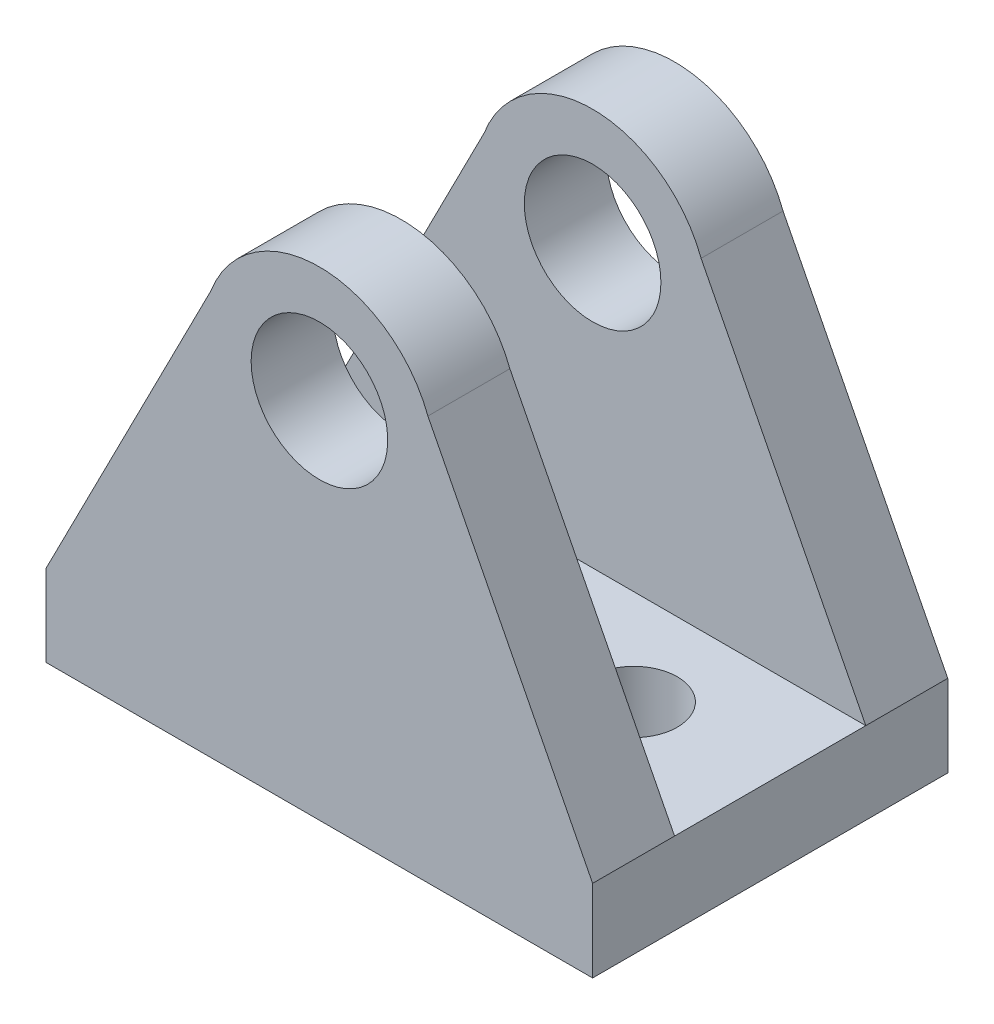
ISO-10303-21;
HEADER;
FILE_DESCRIPTION(('STEP AP214'),'2;1');
FILE_NAME('part.step','',(''),(''),'','','');
FILE_SCHEMA(('AUTOMOTIVE_DESIGN { 1 0 10303 214 1 1 1 1 }'));
ENDSEC;
DATA;
#1=APPLICATION_CONTEXT('core data for automotive mechanical design processes');
#2=APPLICATION_PROTOCOL_DEFINITION('international standard','automotive_design',2000,#1);
#3=PRODUCT_CONTEXT('',#1,'mechanical');
#4=PRODUCT('Part','Part','',(#3));
#5=PRODUCT_RELATED_PRODUCT_CATEGORY('part','',(#4));
#6=PRODUCT_DEFINITION_FORMATION('','',#4);
#7=PRODUCT_DEFINITION_CONTEXT('part definition',#1,'design');
#8=PRODUCT_DEFINITION('design','',#6,#7);
#9=PRODUCT_DEFINITION_SHAPE('','',#8);
#10=(LENGTH_UNIT() NAMED_UNIT(*) SI_UNIT(.MILLI.,.METRE.));
#11=(NAMED_UNIT(*) PLANE_ANGLE_UNIT() SI_UNIT($,.RADIAN.));
#12=(NAMED_UNIT(*) SI_UNIT($,.STERADIAN.) SOLID_ANGLE_UNIT());
#13=UNCERTAINTY_MEASURE_WITH_UNIT(LENGTH_MEASURE(1.E-05),#10,'distance_accuracy_value','');
#14=(GEOMETRIC_REPRESENTATION_CONTEXT(3) GLOBAL_UNCERTAINTY_ASSIGNED_CONTEXT((#13)) GLOBAL_UNIT_ASSIGNED_CONTEXT((#10,
#11,#12)) REPRESENTATION_CONTEXT('',''));
#15=CARTESIAN_POINT('',(0.,0.,0.));
#16=DIRECTION('',(0.,0.,1.));
#17=DIRECTION('',(1.,0.,0.));
#18=AXIS2_PLACEMENT_3D('',#15,#16,#17);
#19=CARTESIAN_POINT('',(45.3430756374336,0.,-44.2194258680597));
#20=DIRECTION('',(1.,0.,0.));
#21=DIRECTION('',(0.,0.,-1.));
#22=AXIS2_PLACEMENT_3D('',#19,#20,#21);
#23=PLANE('',#22);
#24=DIRECTION('',(0.,0.,-1.));
#25=VECTOR('',#24,1.);
#26=CARTESIAN_POINT('',(45.3430756374336,3.,-44.2194258680597));
#27=LINE('',#26,#25);
#28=CARTESIAN_POINT('',(45.3430756374336,3.,-44.2194258680597));
#29=VERTEX_POINT('',#28);
#30=CARTESIAN_POINT('',(45.3430756374336,3.,-51.2194258680596));
#31=VERTEX_POINT('',#30);
#32=EDGE_CURVE('E168',#29,#31,#27,.T.);
#33=ORIENTED_EDGE('',*,*,#32,.F.);
#34=DIRECTION('',(0.,0.,-1.));
#35=VECTOR('',#34,1.);
#36=CARTESIAN_POINT('',(45.3430756374336,3.,-41.2194258680597));
#37=LINE('',#36,#35);
#38=CARTESIAN_POINT('',(45.3430756374336,3.,-41.2194258680597));
#39=VERTEX_POINT('',#38);
#40=EDGE_CURVE('E48',#39,#29,#37,.T.);
#41=ORIENTED_EDGE('',*,*,#40,.F.);
#42=DIRECTION('',(0.,1.,0.));
#43=VECTOR('',#42,1.);
#44=CARTESIAN_POINT('',(45.3430756374336,3.,-41.2194258680597));
#45=LINE('',#44,#43);
#46=CARTESIAN_POINT('',(45.3430756374336,0.,-41.2194258680597));
#47=VERTEX_POINT('',#46);
#48=EDGE_CURVE('E140',#47,#39,#45,.T.);
#49=ORIENTED_EDGE('',*,*,#48,.F.);
#50=DIRECTION('',(0.,0.,-1.));
#51=VECTOR('',#50,1.);
#52=CARTESIAN_POINT('',(45.3430756374336,0.,-44.2194258680597));
#53=LINE('',#52,#51);
#54=CARTESIAN_POINT('',(45.3430756374336,0.,-54.2194258680596));
#55=VERTEX_POINT('',#54);
#56=EDGE_CURVE('E40',#47,#55,#53,.T.);
#57=ORIENTED_EDGE('',*,*,#56,.T.);
#58=DIRECTION('',(0.,-1.,0.));
#59=VECTOR('',#58,1.);
#60=CARTESIAN_POINT('',(45.3430756374336,0.,-54.2194258680596));
#61=LINE('',#60,#59);
#62=CARTESIAN_POINT('',(45.3430756374336,3.,-54.2194258680596));
#63=VERTEX_POINT('',#62);
#64=EDGE_CURVE('E196',#63,#55,#61,.T.);
#65=ORIENTED_EDGE('',*,*,#64,.F.);
#66=DIRECTION('',(0.,0.,1.));
#67=VECTOR('',#66,1.);
#68=CARTESIAN_POINT('',(45.3430756374336,3.,-54.2194258680596));
#69=LINE('',#68,#67);
#70=EDGE_CURVE('E201',#63,#31,#69,.T.);
#71=ORIENTED_EDGE('',*,*,#70,.T.);
#72=EDGE_LOOP('',(#33,#41,#49,#57,#65,#71));
#73=FACE_BOUND('',#72,.T.);
#74=ADVANCED_FACE('F32',(#73),#23,.T.);
#75=CARTESIAN_POINT('',(25.3430756374335,0.,-51.2194258680596));
#76=DIRECTION('',(-1.,0.,0.));
#77=DIRECTION('',(0.,0.,1.));
#78=AXIS2_PLACEMENT_3D('',#75,#76,#77);
#79=PLANE('',#78);
#80=DIRECTION('',(0.,0.,1.));
#81=VECTOR('',#80,1.);
#82=CARTESIAN_POINT('',(25.3430756374335,3.,-51.2194258680596));
#83=LINE('',#82,#81);
#84=CARTESIAN_POINT('',(25.3430756374335,3.,-51.2194258680596));
#85=VERTEX_POINT('',#84);
#86=CARTESIAN_POINT('',(25.3430756374335,3.,-44.2194258680597));
#87=VERTEX_POINT('',#86);
#88=EDGE_CURVE('E130',#85,#87,#83,.T.);
#89=ORIENTED_EDGE('',*,*,#88,.F.);
#90=DIRECTION('',(0.,0.,1.));
#91=VECTOR('',#90,1.);
#92=CARTESIAN_POINT('',(25.3430756374335,3.,-54.2194258680596));
#93=LINE('',#92,#91);
#94=CARTESIAN_POINT('',(25.3430756374335,3.,-54.2194258680596));
#95=VERTEX_POINT('',#94);
#96=EDGE_CURVE('E56',#95,#85,#93,.T.);
#97=ORIENTED_EDGE('',*,*,#96,.F.);
#98=DIRECTION('',(0.,1.,0.));
#99=VECTOR('',#98,1.);
#100=CARTESIAN_POINT('',(25.3430756374335,3.,-54.2194258680596));
#101=LINE('',#100,#99);
#102=CARTESIAN_POINT('',(25.3430756374335,0.,-54.2194258680596));
#103=VERTEX_POINT('',#102);
#104=EDGE_CURVE('E115',#103,#95,#101,.T.);
#105=ORIENTED_EDGE('',*,*,#104,.F.);
#106=DIRECTION('',(0.,0.,1.));
#107=VECTOR('',#106,1.);
#108=CARTESIAN_POINT('',(25.3430756374335,0.,-51.2194258680596));
#109=LINE('',#108,#107);
#110=CARTESIAN_POINT('',(25.3430756374335,0.,-41.2194258680597));
#111=VERTEX_POINT('',#110);
#112=EDGE_CURVE('E11',#103,#111,#109,.T.);
#113=ORIENTED_EDGE('',*,*,#112,.T.);
#114=DIRECTION('',(0.,-1.,0.));
#115=VECTOR('',#114,1.);
#116=CARTESIAN_POINT('',(25.3430756374335,0.,-41.2194258680597));
#117=LINE('',#116,#115);
#118=CARTESIAN_POINT('',(25.3430756374335,3.,-41.2194258680597));
#119=VERTEX_POINT('',#118);
#120=EDGE_CURVE('E150',#119,#111,#117,.T.);
#121=ORIENTED_EDGE('',*,*,#120,.F.);
#122=DIRECTION('',(0.,0.,-1.));
#123=VECTOR('',#122,1.);
#124=CARTESIAN_POINT('',(25.3430756374335,3.,-41.2194258680597));
#125=LINE('',#124,#123);
#126=EDGE_CURVE('E155',#119,#87,#125,.T.);
#127=ORIENTED_EDGE('',*,*,#126,.T.);
#128=EDGE_LOOP('',(#89,#97,#105,#113,#121,#127));
#129=FACE_BOUND('',#128,.T.);
#130=ADVANCED_FACE('F127',(#129),#79,.T.);
#131=CARTESIAN_POINT('',(0.,0.,0.));
#132=DIRECTION('',(0.,1.,0.));
#133=DIRECTION('',(0.,0.,1.));
#134=AXIS2_PLACEMENT_3D('',#131,#132,#133);
#135=PLANE('',#134);
#136=CARTESIAN_POINT('',(40.3430756374337,0.,-47.7194258680598));
#137=DIRECTION('',(0.,-1.,0.));
#138=DIRECTION('',(0.,0.,-1.));
#139=AXIS2_PLACEMENT_3D('',#136,#137,#138);
#140=CIRCLE('',#139,1.59999999999981);
#141=CARTESIAN_POINT('',(40.3430756374337,0.,-49.3194258680596));
#142=VERTEX_POINT('',#141);
#143=EDGE_CURVE('E232',#142,#142,#140,.T.);
#144=ORIENTED_EDGE('',*,*,#143,.F.);
#145=EDGE_LOOP('',(#144));
#146=FACE_BOUND('',#145,.T.);
#147=CARTESIAN_POINT('',(30.3430756374334,0.,-47.7194258680598));
#148=DIRECTION('',(0.,-1.,0.));
#149=DIRECTION('',(0.,0.,-1.));
#150=AXIS2_PLACEMENT_3D('',#147,#148,#149);
#151=CIRCLE('',#150,1.59999999999981);
#152=CARTESIAN_POINT('',(30.3430756374334,0.,-49.3194258680596));
#153=VERTEX_POINT('',#152);
#154=EDGE_CURVE('E226',#153,#153,#151,.T.);
#155=ORIENTED_EDGE('',*,*,#154,.F.);
#156=EDGE_LOOP('',(#155));
#157=FACE_BOUND('',#156,.T.);
#158=ORIENTED_EDGE('',*,*,#56,.F.);
#159=DIRECTION('',(1.,0.,0.));
#160=VECTOR('',#159,1.);
#161=CARTESIAN_POINT('',(45.3430756374336,0.,-41.2194258680597));
#162=LINE('',#161,#160);
#163=EDGE_CURVE('E153',#111,#47,#162,.T.);
#164=ORIENTED_EDGE('',*,*,#163,.F.);
#165=ORIENTED_EDGE('',*,*,#112,.F.);
#166=DIRECTION('',(-1.,0.,0.));
#167=VECTOR('',#166,1.);
#168=CARTESIAN_POINT('',(25.3430756374335,0.,-54.2194258680596));
#169=LINE('',#168,#167);
#170=EDGE_CURVE('E122',#55,#103,#169,.T.);
#171=ORIENTED_EDGE('',*,*,#170,.F.);
#172=EDGE_LOOP('',(#158,#164,#165,#171));
#173=FACE_BOUND('',#172,.T.);
#174=ADVANCED_FACE('F192',(#146,#157,#173),#135,.F.);
#175=CARTESIAN_POINT('',(0.,3.,0.));
#176=DIRECTION('',(0.,1.,0.));
#177=DIRECTION('',(0.,0.,1.));
#178=AXIS2_PLACEMENT_3D('',#175,#176,#177);
#179=PLANE('',#178);
#180=CARTESIAN_POINT('',(40.3430756374337,3.,-47.7194258680598));
#181=DIRECTION('',(0.,1.,0.));
#182=DIRECTION('',(0.,0.,1.));
#183=AXIS2_PLACEMENT_3D('',#180,#181,#182);
#184=CIRCLE('',#183,1.59999999999981);
#185=CARTESIAN_POINT('',(40.3430756374337,3.,-46.11942586806));
#186=VERTEX_POINT('',#185);
#187=EDGE_CURVE('E229',#186,#186,#184,.T.);
#188=ORIENTED_EDGE('',*,*,#187,.F.);
#189=EDGE_LOOP('',(#188));
#190=FACE_BOUND('',#189,.T.);
#191=CARTESIAN_POINT('',(30.3430756374334,3.,-47.7194258680598));
#192=DIRECTION('',(0.,1.,0.));
#193=DIRECTION('',(0.,0.,1.));
#194=AXIS2_PLACEMENT_3D('',#191,#192,#193);
#195=CIRCLE('',#194,1.59999999999981);
#196=CARTESIAN_POINT('',(30.3430756374334,3.,-46.11942586806));
#197=VERTEX_POINT('',#196);
#198=EDGE_CURVE('E209',#197,#197,#195,.T.);
#199=ORIENTED_EDGE('',*,*,#198,.F.);
#200=EDGE_LOOP('',(#199));
#201=FACE_BOUND('',#200,.T.);
#202=ORIENTED_EDGE('',*,*,#32,.T.);
#203=DIRECTION('',(-1.,0.,0.));
#204=VECTOR('',#203,1.);
#205=CARTESIAN_POINT('',(45.3430756374336,3.,-51.2194258680596));
#206=LINE('',#205,#204);
#207=EDGE_CURVE('E172',#31,#85,#206,.T.);
#208=ORIENTED_EDGE('',*,*,#207,.T.);
#209=ORIENTED_EDGE('',*,*,#88,.T.);
#210=DIRECTION('',(1.,0.,0.));
#211=VECTOR('',#210,1.);
#212=CARTESIAN_POINT('',(25.3430756374335,3.,-44.2194258680597));
#213=LINE('',#212,#211);
#214=EDGE_CURVE('E35',#87,#29,#213,.T.);
#215=ORIENTED_EDGE('',*,*,#214,.T.);
#216=EDGE_LOOP('',(#202,#208,#209,#215));
#217=FACE_BOUND('',#216,.T.);
#218=ADVANCED_FACE('F175',(#190,#201,#217),#179,.T.);
#219=CARTESIAN_POINT('',(35.3430756374336,13.3,-44.2194258680597));
#220=DIRECTION('',(0.,0.,-1.));
#221=DIRECTION('',(-1.,0.,0.));
#222=AXIS2_PLACEMENT_3D('',#219,#220,#221);
#223=PLANE('',#222);
#224=CARTESIAN_POINT('',(35.3430691595237,13.3000053075812,-44.2194258680597));
#225=DIRECTION('',(0.,0.,-1.));
#226=DIRECTION('',(-1.,0.,0.));
#227=AXIS2_PLACEMENT_3D('',#224,#225,#226);
#228=CIRCLE('',#227,2.49999999999999);
#229=CARTESIAN_POINT('',(32.8430691595237,13.3000053075812,-44.2194258680597));
#230=VERTEX_POINT('',#229);
#231=EDGE_CURVE('E244',#230,#230,#228,.T.);
#232=ORIENTED_EDGE('',*,*,#231,.F.);
#233=EDGE_LOOP('',(#232));
#234=FACE_BOUND('',#233,.T.);
#235=ORIENTED_EDGE('',*,*,#214,.F.);
#236=DIRECTION('',(-0.454990905686481,-0.890496084069209,0.));
#237=VECTOR('',#236,1.);
#238=CARTESIAN_POINT('',(25.3430756374335,3.,-44.2194258680597));
#239=LINE('',#238,#237);
#240=CARTESIAN_POINT('',(31.3721787218253,14.8000000000001,-44.2194258680597));
#241=VERTEX_POINT('',#240);
#242=EDGE_CURVE('E144',#241,#87,#239,.T.);
#243=ORIENTED_EDGE('',*,*,#242,.F.);
#244=CARTESIAN_POINT('',(35.3430756374336,13.3,-44.2194258680597));
#245=DIRECTION('',(0.,0.,1.));
#246=DIRECTION('',(-1.,0.,0.));
#247=AXIS2_PLACEMENT_3D('',#244,#245,#246);
#248=CIRCLE('',#247,4.24476410585876);
#249=CARTESIAN_POINT('',(39.3139725530418,14.8000000000001,-44.2194258680597));
#250=VERTEX_POINT('',#249);
#251=EDGE_CURVE('E134',#250,#241,#248,.T.);
#252=ORIENTED_EDGE('',*,*,#251,.F.);
#253=DIRECTION('',(-0.45499090568648,0.890496084069209,0.));
#254=VECTOR('',#253,1.);
#255=CARTESIAN_POINT('',(39.3139725530418,14.8000000000001,-44.2194258680597));
#256=LINE('',#255,#254);
#257=EDGE_CURVE('E132',#29,#250,#256,.T.);
#258=ORIENTED_EDGE('',*,*,#257,.F.);
#259=EDGE_LOOP('',(#235,#243,#252,#258));
#260=FACE_BOUND('',#259,.T.);
#261=ADVANCED_FACE('F179',(#234,#260),#223,.T.);
#262=CARTESIAN_POINT('',(39.3139725530418,14.8000000000001,-41.2194258680597));
#263=DIRECTION('',(-0.890496084069209,-0.45499090568648,0.));
#264=DIRECTION('',(0.45499090568648,-0.890496084069209,0.));
#265=AXIS2_PLACEMENT_3D('',#262,#263,#264);
#266=PLANE('',#265);
#267=ORIENTED_EDGE('',*,*,#257,.T.);
#268=DIRECTION('',(0.,0.,-1.));
#269=VECTOR('',#268,1.);
#270=CARTESIAN_POINT('',(39.3139725530418,14.8000000000001,-41.2194258680597));
#271=LINE('',#270,#269);
#272=CARTESIAN_POINT('',(39.3139725530418,14.8000000000001,-41.2194258680597));
#273=VERTEX_POINT('',#272);
#274=EDGE_CURVE('E164',#273,#250,#271,.T.);
#275=ORIENTED_EDGE('',*,*,#274,.F.);
#276=DIRECTION('',(-0.45499090568648,0.890496084069209,0.));
#277=VECTOR('',#276,1.);
#278=CARTESIAN_POINT('',(39.3139725530418,14.8000000000001,-41.2194258680597));
#279=LINE('',#278,#277);
#280=EDGE_CURVE('E143',#39,#273,#279,.T.);
#281=ORIENTED_EDGE('',*,*,#280,.F.);
#282=ORIENTED_EDGE('',*,*,#40,.T.);
#283=EDGE_LOOP('',(#267,#275,#281,#282));
#284=FACE_BOUND('',#283,.T.);
#285=ADVANCED_FACE('F251',(#284),#266,.F.);
#286=CARTESIAN_POINT('',(35.3430756374336,13.3,-41.2194258680597));
#287=DIRECTION('',(0.,0.,-1.));
#288=DIRECTION('',(-1.,0.,0.));
#289=AXIS2_PLACEMENT_3D('',#286,#287,#288);
#290=CYLINDRICAL_SURFACE('',#289,4.24476410585876);
#291=ORIENTED_EDGE('',*,*,#251,.T.);
#292=DIRECTION('',(0.,0.,-1.));
#293=VECTOR('',#292,1.);
#294=CARTESIAN_POINT('',(31.3721787218253,14.8000000000001,-41.2194258680597));
#295=LINE('',#294,#293);
#296=CARTESIAN_POINT('',(31.3721787218253,14.8000000000001,-41.2194258680597));
#297=VERTEX_POINT('',#296);
#298=EDGE_CURVE('E161',#297,#241,#295,.T.);
#299=ORIENTED_EDGE('',*,*,#298,.F.);
#300=CARTESIAN_POINT('',(35.3430756374336,13.3,-41.2194258680597));
#301=DIRECTION('',(0.,0.,1.));
#302=DIRECTION('',(-1.,0.,0.));
#303=AXIS2_PLACEMENT_3D('',#300,#301,#302);
#304=CIRCLE('',#303,4.24476410585876);
#305=EDGE_CURVE('E146',#273,#297,#304,.T.);
#306=ORIENTED_EDGE('',*,*,#305,.F.);
#307=ORIENTED_EDGE('',*,*,#274,.T.);
#308=EDGE_LOOP('',(#291,#299,#306,#307));
#309=FACE_BOUND('',#308,.T.);
#310=ADVANCED_FACE('F257',(#309),#290,.T.);
#311=CARTESIAN_POINT('',(25.3430756374335,3.,-41.2194258680597));
#312=DIRECTION('',(0.890496084069209,-0.454990905686481,0.));
#313=DIRECTION('',(0.454990905686481,0.890496084069209,0.));
#314=AXIS2_PLACEMENT_3D('',#311,#312,#313);
#315=PLANE('',#314);
#316=ORIENTED_EDGE('',*,*,#242,.T.);
#317=ORIENTED_EDGE('',*,*,#126,.F.);
#318=DIRECTION('',(-0.454990905686481,-0.890496084069209,0.));
#319=VECTOR('',#318,1.);
#320=CARTESIAN_POINT('',(25.3430756374335,3.,-41.2194258680597));
#321=LINE('',#320,#319);
#322=EDGE_CURVE('E148',#297,#119,#321,.T.);
#323=ORIENTED_EDGE('',*,*,#322,.F.);
#324=ORIENTED_EDGE('',*,*,#298,.T.);
#325=EDGE_LOOP('',(#316,#317,#323,#324));
#326=FACE_BOUND('',#325,.T.);
#327=ADVANCED_FACE('F183',(#326),#315,.F.);
#328=CARTESIAN_POINT('',(35.3430756374336,13.3,-41.2194258680597));
#329=DIRECTION('',(0.,0.,-1.));
#330=DIRECTION('',(-1.,0.,0.));
#331=AXIS2_PLACEMENT_3D('',#328,#329,#330);
#332=PLANE('',#331);
#333=CARTESIAN_POINT('',(35.3430691595237,13.3000053075812,-41.2194258680597));
#334=DIRECTION('',(0.,0.,-1.));
#335=DIRECTION('',(-1.,0.,0.));
#336=AXIS2_PLACEMENT_3D('',#333,#334,#335);
#337=CIRCLE('',#336,2.49999999999999);
#338=CARTESIAN_POINT('',(32.8430691595237,13.3000053075812,-41.2194258680597));
#339=VERTEX_POINT('',#338);
#340=EDGE_CURVE('E241',#339,#339,#337,.T.);
#341=ORIENTED_EDGE('',*,*,#340,.T.);
#342=EDGE_LOOP('',(#341));
#343=FACE_BOUND('',#342,.T.);
#344=ORIENTED_EDGE('',*,*,#48,.T.);
#345=ORIENTED_EDGE('',*,*,#280,.T.);
#346=ORIENTED_EDGE('',*,*,#305,.T.);
#347=ORIENTED_EDGE('',*,*,#322,.T.);
#348=ORIENTED_EDGE('',*,*,#120,.T.);
#349=ORIENTED_EDGE('',*,*,#163,.T.);
#350=EDGE_LOOP('',(#344,#345,#346,#347,#348,#349));
#351=FACE_BOUND('',#350,.T.);
#352=ADVANCED_FACE('F189',(#343,#351),#332,.F.);
#353=CARTESIAN_POINT('',(35.3430691595237,13.3000053075812,-51.2194258680596));
#354=DIRECTION('',(0.,0.,1.));
#355=DIRECTION('',(1.,0.,0.));
#356=AXIS2_PLACEMENT_3D('',#353,#354,#355);
#357=PLANE('',#356);
#358=CARTESIAN_POINT('',(35.3430691595237,13.3000053075812,-51.2194258680596));
#359=DIRECTION('',(0.,0.,1.));
#360=DIRECTION('',(1.,0.,0.));
#361=AXIS2_PLACEMENT_3D('',#358,#359,#360);
#362=CIRCLE('',#361,2.5);
#363=CARTESIAN_POINT('',(37.8430691595237,13.3000053075812,-51.2194258680596));
#364=VERTEX_POINT('',#363);
#365=EDGE_CURVE('E235',#364,#364,#362,.T.);
#366=ORIENTED_EDGE('',*,*,#365,.F.);
#367=EDGE_LOOP('',(#366));
#368=FACE_BOUND('',#367,.T.);
#369=ORIENTED_EDGE('',*,*,#207,.F.);
#370=DIRECTION('',(0.454991131058374,-0.890495968917446,0.));
#371=VECTOR('',#370,1.);
#372=CARTESIAN_POINT('',(45.3430756374336,3.,-51.2194258680596));
#373=LINE('',#372,#371);
#374=CARTESIAN_POINT('',(39.3139660751319,14.8000053075813,-51.2194258680596));
#375=VERTEX_POINT('',#374);
#376=EDGE_CURVE('E124',#375,#31,#373,.T.);
#377=ORIENTED_EDGE('',*,*,#376,.F.);
#378=CARTESIAN_POINT('',(35.3430691595237,13.3000053075812,-51.2194258680596));
#379=DIRECTION('',(0.,0.,-1.));
#380=DIRECTION('',(1.,0.,0.));
#381=AXIS2_PLACEMENT_3D('',#378,#379,#380);
#382=CIRCLE('',#381,4.24476410585876);
#383=CARTESIAN_POINT('',(31.3721722439155,14.8000053075813,-51.2194258680596));
#384=VERTEX_POINT('',#383);
#385=EDGE_CURVE('E208',#384,#375,#382,.T.);
#386=ORIENTED_EDGE('',*,*,#385,.F.);
#387=DIRECTION('',(0.454990355742182,0.890496365058052,0.));
#388=VECTOR('',#387,1.);
#389=CARTESIAN_POINT('',(31.3721722439155,14.8000053075813,-51.2194258680596));
#390=LINE('',#389,#388);
#391=EDGE_CURVE('E206',#85,#384,#390,.T.);
#392=ORIENTED_EDGE('',*,*,#391,.F.);
#393=EDGE_LOOP('',(#369,#377,#386,#392));
#394=FACE_BOUND('',#393,.T.);
#395=ADVANCED_FACE('F221',(#368,#394),#357,.T.);
#396=CARTESIAN_POINT('',(31.3721722439155,14.8000053075813,-54.2194258680596));
#397=DIRECTION('',(0.890496365058051,-0.454990355742182,0.));
#398=DIRECTION('',(0.454990355742182,0.890496365058052,0.));
#399=AXIS2_PLACEMENT_3D('',#396,#397,#398);
#400=PLANE('',#399);
#401=ORIENTED_EDGE('',*,*,#391,.T.);
#402=DIRECTION('',(0.,0.,1.));
#403=VECTOR('',#402,1.);
#404=CARTESIAN_POINT('',(31.3721722439155,14.8000053075813,-54.2194258680596));
#405=LINE('',#404,#403);
#406=CARTESIAN_POINT('',(31.3721722439155,14.8000053075813,-54.2194258680596));
#407=VERTEX_POINT('',#406);
#408=EDGE_CURVE('E111',#407,#384,#405,.T.);
#409=ORIENTED_EDGE('',*,*,#408,.F.);
#410=DIRECTION('',(0.454990355742182,0.890496365058052,0.));
#411=VECTOR('',#410,1.);
#412=CARTESIAN_POINT('',(31.3721722439155,14.8000053075813,-54.2194258680596));
#413=LINE('',#412,#411);
#414=EDGE_CURVE('E107',#95,#407,#413,.T.);
#415=ORIENTED_EDGE('',*,*,#414,.F.);
#416=ORIENTED_EDGE('',*,*,#96,.T.);
#417=EDGE_LOOP('',(#401,#409,#415,#416));
#418=FACE_BOUND('',#417,.T.);
#419=ADVANCED_FACE('F109',(#418),#400,.F.);
#420=CARTESIAN_POINT('',(35.3430691595237,13.3000053075812,-54.2194258680596));
#421=DIRECTION('',(0.,0.,1.));
#422=DIRECTION('',(1.,0.,0.));
#423=AXIS2_PLACEMENT_3D('',#420,#421,#422);
#424=CYLINDRICAL_SURFACE('',#423,4.24476410585876);
#425=ORIENTED_EDGE('',*,*,#385,.T.);
#426=DIRECTION('',(0.,0.,1.));
#427=VECTOR('',#426,1.);
#428=CARTESIAN_POINT('',(39.3139660751319,14.8000053075813,-54.2194258680596));
#429=LINE('',#428,#427);
#430=CARTESIAN_POINT('',(39.3139660751319,14.8000053075813,-54.2194258680596));
#431=VERTEX_POINT('',#430);
#432=EDGE_CURVE('E136',#431,#375,#429,.T.);
#433=ORIENTED_EDGE('',*,*,#432,.F.);
#434=CARTESIAN_POINT('',(35.3430691595237,13.3000053075812,-54.2194258680596));
#435=DIRECTION('',(0.,0.,-1.));
#436=DIRECTION('',(1.,0.,0.));
#437=AXIS2_PLACEMENT_3D('',#434,#435,#436);
#438=CIRCLE('',#437,4.24476410585876);
#439=EDGE_CURVE('E114',#407,#431,#438,.T.);
#440=ORIENTED_EDGE('',*,*,#439,.F.);
#441=ORIENTED_EDGE('',*,*,#408,.T.);
#442=EDGE_LOOP('',(#425,#433,#440,#441));
#443=FACE_BOUND('',#442,.T.);
#444=ADVANCED_FACE('F222',(#443),#424,.T.);
#445=CARTESIAN_POINT('',(45.3430756374336,3.,-54.2194258680596));
#446=DIRECTION('',(-0.890495968917446,-0.454991131058374,0.));
#447=DIRECTION('',(0.454991131058374,-0.890495968917446,0.));
#448=AXIS2_PLACEMENT_3D('',#445,#446,#447);
#449=PLANE('',#448);
#450=ORIENTED_EDGE('',*,*,#376,.T.);
#451=ORIENTED_EDGE('',*,*,#70,.F.);
#452=DIRECTION('',(0.454991131058374,-0.890495968917446,0.));
#453=VECTOR('',#452,1.);
#454=CARTESIAN_POINT('',(45.3430756374336,3.,-54.2194258680596));
#455=LINE('',#454,#453);
#456=EDGE_CURVE('E198',#431,#63,#455,.T.);
#457=ORIENTED_EDGE('',*,*,#456,.F.);
#458=ORIENTED_EDGE('',*,*,#432,.T.);
#459=EDGE_LOOP('',(#450,#451,#457,#458));
#460=FACE_BOUND('',#459,.T.);
#461=ADVANCED_FACE('F217',(#460),#449,.F.);
#462=CARTESIAN_POINT('',(35.3430691595237,13.3000053075812,-54.2194258680596));
#463=DIRECTION('',(0.,0.,1.));
#464=DIRECTION('',(1.,0.,0.));
#465=AXIS2_PLACEMENT_3D('',#462,#463,#464);
#466=PLANE('',#465);
#467=CARTESIAN_POINT('',(35.3430691595237,13.3000053075812,-54.2194258680596));
#468=DIRECTION('',(0.,0.,-1.));
#469=DIRECTION('',(-1.,0.,0.));
#470=AXIS2_PLACEMENT_3D('',#467,#468,#469);
#471=CIRCLE('',#470,2.49999999999999);
#472=CARTESIAN_POINT('',(32.8430691595237,13.3000053075812,-54.2194258680596));
#473=VERTEX_POINT('',#472);
#474=EDGE_CURVE('E238',#473,#473,#471,.T.);
#475=ORIENTED_EDGE('',*,*,#474,.F.);
#476=EDGE_LOOP('',(#475));
#477=FACE_BOUND('',#476,.T.);
#478=ORIENTED_EDGE('',*,*,#104,.T.);
#479=ORIENTED_EDGE('',*,*,#414,.T.);
#480=ORIENTED_EDGE('',*,*,#439,.T.);
#481=ORIENTED_EDGE('',*,*,#456,.T.);
#482=ORIENTED_EDGE('',*,*,#64,.T.);
#483=ORIENTED_EDGE('',*,*,#170,.T.);
#484=EDGE_LOOP('',(#478,#479,#480,#481,#482,#483));
#485=FACE_BOUND('',#484,.T.);
#486=ADVANCED_FACE('F119',(#477,#485),#466,.F.);
#487=CARTESIAN_POINT('',(30.3430756374334,0.,-47.7194258680598));
#488=DIRECTION('',(0.,-1.,0.));
#489=DIRECTION('',(0.,0.,-1.));
#490=AXIS2_PLACEMENT_3D('',#487,#488,#489);
#491=CYLINDRICAL_SURFACE('',#490,1.59999999999981);
#492=ORIENTED_EDGE('',*,*,#198,.T.);
#493=EDGE_LOOP('',(#492));
#494=FACE_BOUND('',#493,.T.);
#495=ORIENTED_EDGE('',*,*,#154,.T.);
#496=EDGE_LOOP('',(#495));
#497=FACE_BOUND('',#496,.T.);
#498=ADVANCED_FACE('F294',(#494,#497),#491,.F.);
#499=CARTESIAN_POINT('',(40.3430756374337,0.,-47.7194258680598));
#500=DIRECTION('',(0.,-1.,0.));
#501=DIRECTION('',(0.,0.,-1.));
#502=AXIS2_PLACEMENT_3D('',#499,#500,#501);
#503=CYLINDRICAL_SURFACE('',#502,1.59999999999981);
#504=ORIENTED_EDGE('',*,*,#187,.T.);
#505=EDGE_LOOP('',(#504));
#506=FACE_BOUND('',#505,.T.);
#507=ORIENTED_EDGE('',*,*,#143,.T.);
#508=EDGE_LOOP('',(#507));
#509=FACE_BOUND('',#508,.T.);
#510=ADVANCED_FACE('F298',(#506,#509),#503,.F.);
#511=CARTESIAN_POINT('',(35.3430691595237,13.3000053075812,-54.2194258680596));
#512=DIRECTION('',(0.,0.,-1.));
#513=DIRECTION('',(-1.,0.,0.));
#514=AXIS2_PLACEMENT_3D('',#511,#512,#513);
#515=CYLINDRICAL_SURFACE('',#514,2.5);
#516=ORIENTED_EDGE('',*,*,#474,.T.);
#517=EDGE_LOOP('',(#516));
#518=FACE_BOUND('',#517,.T.);
#519=ORIENTED_EDGE('',*,*,#365,.T.);
#520=EDGE_LOOP('',(#519));
#521=FACE_BOUND('',#520,.T.);
#522=ADVANCED_FACE('F302',(#518,#521),#515,.F.);
#523=CARTESIAN_POINT('',(35.3430691595237,13.3000053075812,-44.2194258680597));
#524=DIRECTION('',(0.,0.,-1.));
#525=DIRECTION('',(-1.,0.,0.));
#526=AXIS2_PLACEMENT_3D('',#523,#524,#525);
#527=CYLINDRICAL_SURFACE('',#526,2.49999999999999);
#528=ORIENTED_EDGE('',*,*,#340,.F.);
#529=EDGE_LOOP('',(#528));
#530=FACE_BOUND('',#529,.T.);
#531=ORIENTED_EDGE('',*,*,#231,.T.);
#532=EDGE_LOOP('',(#531));
#533=FACE_BOUND('',#532,.T.);
#534=ADVANCED_FACE('F248',(#530,#533),#527,.F.);
#535=CLOSED_SHELL('',(#74,#130,#174,#218,#261,#285,#310,#327,#352,#395,#419,#444,#461,#486,#498,
#510,#522,#534));
#536=MANIFOLD_SOLID_BREP('B2',#535);
#537=ADVANCED_BREP_SHAPE_REPRESENTATION('',(#18,#536),#14);
#538=SHAPE_DEFINITION_REPRESENTATION(#9,#537);
ENDSEC;
END-ISO-10303-21;
